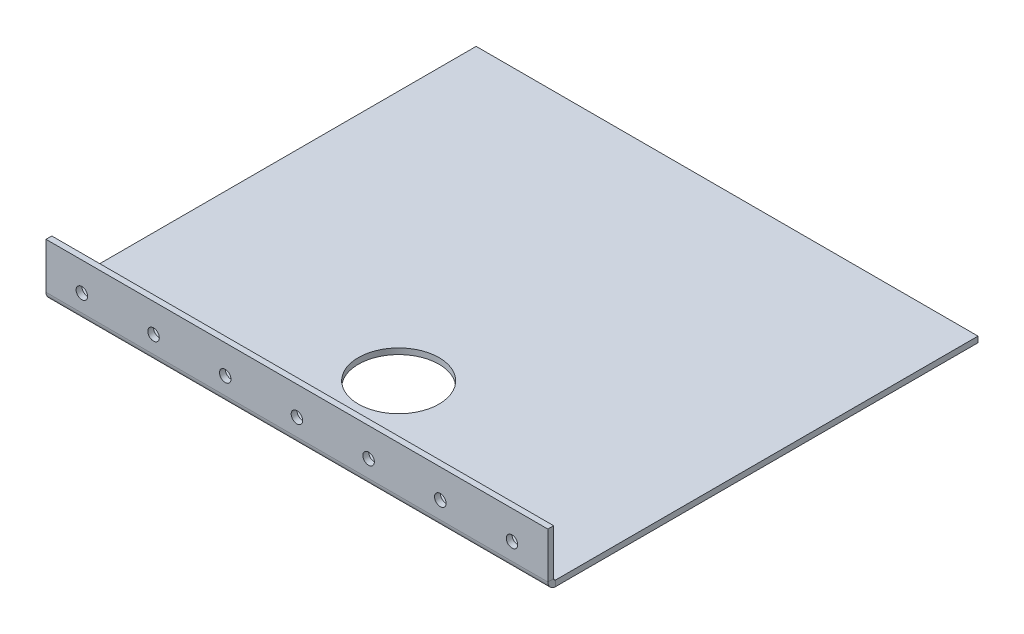
ISO-10303-21;
HEADER;
FILE_DESCRIPTION(('STEP AP214'),'2;1');
FILE_NAME('part.step','',(''),(''),'','','');
FILE_SCHEMA(('AUTOMOTIVE_DESIGN { 1 0 10303 214 1 1 1 1 }'));
ENDSEC;
DATA;
#1=APPLICATION_CONTEXT('core data for automotive mechanical design processes');
#2=APPLICATION_PROTOCOL_DEFINITION('international standard','automotive_design',2000,#1);
#3=PRODUCT_CONTEXT('',#1,'mechanical');
#4=PRODUCT('Part','Part','',(#3));
#5=PRODUCT_RELATED_PRODUCT_CATEGORY('part','',(#4));
#6=PRODUCT_DEFINITION_FORMATION('','',#4);
#7=PRODUCT_DEFINITION_CONTEXT('part definition',#1,'design');
#8=PRODUCT_DEFINITION('design','',#6,#7);
#9=PRODUCT_DEFINITION_SHAPE('','',#8);
#10=(LENGTH_UNIT() NAMED_UNIT(*) SI_UNIT(.MILLI.,.METRE.));
#11=(NAMED_UNIT(*) PLANE_ANGLE_UNIT() SI_UNIT($,.RADIAN.));
#12=(NAMED_UNIT(*) SI_UNIT($,.STERADIAN.) SOLID_ANGLE_UNIT());
#13=UNCERTAINTY_MEASURE_WITH_UNIT(LENGTH_MEASURE(1.E-05),#10,'distance_accuracy_value','');
#14=(GEOMETRIC_REPRESENTATION_CONTEXT(3) GLOBAL_UNCERTAINTY_ASSIGNED_CONTEXT((#13)) GLOBAL_UNIT_ASSIGNED_CONTEXT((#10,
#11,#12)) REPRESENTATION_CONTEXT('',''));
#15=CARTESIAN_POINT('',(0.,0.,0.));
#16=DIRECTION('',(0.,0.,1.));
#17=DIRECTION('',(1.,0.,0.));
#18=AXIS2_PLACEMENT_3D('',#15,#16,#17);
#19=CARTESIAN_POINT('',(-5461.00000000001,-2.05232,-2754.08571428572));
#20=DIRECTION('',(1.,0.,0.));
#21=DIRECTION('',(0.,0.,-1.));
#22=AXIS2_PLACEMENT_3D('',#19,#20,#21);
#23=PLANE('',#22);
#24=DIRECTION('',(0.,0.,-1.));
#25=VECTOR('',#24,1.);
#26=CARTESIAN_POINT('',(-5461.00000000001,0.,-2754.08571428572));
#27=LINE('',#26,#25);
#28=CARTESIAN_POINT('',(-5461.00000000001,0.,-2604.47463428571));
#29=VERTEX_POINT('',#28);
#30=CARTESIAN_POINT('',(-5461.00000000001,0.,-2754.08571428572));
#31=VERTEX_POINT('',#30);
#32=EDGE_CURVE('E102',#29,#31,#27,.T.);
#33=ORIENTED_EDGE('',*,*,#32,.F.);
#34=DIRECTION('',(0.,-1.,6.02890591705054E-13));
#35=VECTOR('',#34,1.);
#36=CARTESIAN_POINT('',(-5461.00000000001,0.,-2604.47463428571));
#37=LINE('',#36,#35);
#38=CARTESIAN_POINT('',(-5461.00000000001,-2.05232,-2604.47463428571));
#39=VERTEX_POINT('',#38);
#40=EDGE_CURVE('E115',#29,#39,#37,.T.);
#41=ORIENTED_EDGE('',*,*,#40,.T.);
#42=DIRECTION('',(0.,0.,-1.));
#43=VECTOR('',#42,1.);
#44=CARTESIAN_POINT('',(-5461.00000000001,-2.05232,-2754.08571428572));
#45=LINE('',#44,#43);
#46=CARTESIAN_POINT('',(-5461.00000000001,-2.05232,-2754.08571428572));
#47=VERTEX_POINT('',#46);
#48=EDGE_CURVE('E108',#39,#47,#45,.T.);
#49=ORIENTED_EDGE('',*,*,#48,.T.);
#50=DIRECTION('',(0.,1.,0.));
#51=VECTOR('',#50,1.);
#52=CARTESIAN_POINT('',(-5461.00000000001,-2.05232,-2754.08571428572));
#53=LINE('',#52,#51);
#54=EDGE_CURVE('E64',#47,#31,#53,.T.);
#55=ORIENTED_EDGE('',*,*,#54,.T.);
#56=EDGE_LOOP('',(#33,#41,#49,#55));
#57=FACE_BOUND('',#56,.T.);
#58=ADVANCED_FACE('F55',(#57),#23,.T.);
#59=CARTESIAN_POINT('',(0.,-2.05232,0.));
#60=DIRECTION('',(0.,1.,0.));
#61=DIRECTION('',(0.,0.,1.));
#62=AXIS2_PLACEMENT_3D('',#59,#60,#61);
#63=PLANE('',#62);
#64=CARTESIAN_POINT('',(-5549.90000000001,-2.05232,-2637.73339428571));
#65=DIRECTION('',(0.,-1.,0.));
#66=DIRECTION('',(0.,0.,-1.));
#67=AXIS2_PLACEMENT_3D('',#64,#65,#66);
#68=CIRCLE('',#67,14.2875);
#69=CARTESIAN_POINT('',(-5549.90000000001,-2.05232,-2652.02089428571));
#70=VERTEX_POINT('',#69);
#71=EDGE_CURVE('E213',#70,#70,#68,.T.);
#72=ORIENTED_EDGE('',*,*,#71,.F.);
#73=EDGE_LOOP('',(#72));
#74=FACE_BOUND('',#73,.T.);
#75=DIRECTION('',(1.,0.,0.));
#76=VECTOR('',#75,1.);
#77=CARTESIAN_POINT('',(-5461.00000000001,-2.05232,-2604.47463428571));
#78=LINE('',#77,#76);
#79=CARTESIAN_POINT('',(-5638.80000000001,-2.05232,-2604.47463428571));
#80=VERTEX_POINT('',#79);
#81=EDGE_CURVE('E131',#39,#80,#78,.F.);
#82=ORIENTED_EDGE('',*,*,#81,.T.);
#83=DIRECTION('',(0.,0.,1.));
#84=VECTOR('',#83,1.);
#85=CARTESIAN_POINT('',(-5638.80000000001,-2.05232,-2754.08571428572));
#86=LINE('',#85,#84);
#87=CARTESIAN_POINT('',(-5638.80000000001,-2.05232,-2754.08571428572));
#88=VERTEX_POINT('',#87);
#89=EDGE_CURVE('E106',#88,#80,#86,.T.);
#90=ORIENTED_EDGE('',*,*,#89,.F.);
#91=DIRECTION('',(-1.,0.,0.));
#92=VECTOR('',#91,1.);
#93=CARTESIAN_POINT('',(-5638.80000000001,-2.05232,-2754.08571428572));
#94=LINE('',#93,#92);
#95=EDGE_CURVE('E96',#47,#88,#94,.T.);
#96=ORIENTED_EDGE('',*,*,#95,.F.);
#97=ORIENTED_EDGE('',*,*,#48,.F.);
#98=EDGE_LOOP('',(#82,#90,#96,#97));
#99=FACE_BOUND('',#98,.T.);
#100=ADVANCED_FACE('F223',(#74,#99),#63,.F.);
#101=CARTESIAN_POINT('',(0.,0.,0.));
#102=DIRECTION('',(0.,1.,0.));
#103=DIRECTION('',(0.,0.,1.));
#104=AXIS2_PLACEMENT_3D('',#101,#102,#103);
#105=PLANE('',#104);
#106=CARTESIAN_POINT('',(-5549.90000000001,0.,-2637.73339428571));
#107=DIRECTION('',(0.,1.,0.));
#108=DIRECTION('',(0.,0.,1.));
#109=AXIS2_PLACEMENT_3D('',#106,#107,#108);
#110=CIRCLE('',#109,14.2875);
#111=CARTESIAN_POINT('',(-5549.90000000001,0.,-2623.44589428571));
#112=VERTEX_POINT('',#111);
#113=EDGE_CURVE('E59',#112,#112,#110,.T.);
#114=ORIENTED_EDGE('',*,*,#113,.F.);
#115=EDGE_LOOP('',(#114));
#116=FACE_BOUND('',#115,.T.);
#117=DIRECTION('',(0.,0.,1.));
#118=VECTOR('',#117,1.);
#119=CARTESIAN_POINT('',(-5638.80000000001,0.,-2754.08571428572));
#120=LINE('',#119,#118);
#121=CARTESIAN_POINT('',(-5638.80000000001,0.,-2754.08571428572));
#122=VERTEX_POINT('',#121);
#123=CARTESIAN_POINT('',(-5638.80000000001,0.,-2604.47463428571));
#124=VERTEX_POINT('',#123);
#125=EDGE_CURVE('E98',#122,#124,#120,.T.);
#126=ORIENTED_EDGE('',*,*,#125,.T.);
#127=DIRECTION('',(1.,0.,0.));
#128=VECTOR('',#127,1.);
#129=CARTESIAN_POINT('',(-5461.00000000001,0.,-2604.47463428571));
#130=LINE('',#129,#128);
#131=EDGE_CURVE('E72',#29,#124,#130,.F.);
#132=ORIENTED_EDGE('',*,*,#131,.F.);
#133=ORIENTED_EDGE('',*,*,#32,.T.);
#134=DIRECTION('',(-1.,0.,0.));
#135=VECTOR('',#134,1.);
#136=CARTESIAN_POINT('',(-5638.80000000001,0.,-2754.08571428572));
#137=LINE('',#136,#135);
#138=EDGE_CURVE('E94',#31,#122,#137,.T.);
#139=ORIENTED_EDGE('',*,*,#138,.T.);
#140=EDGE_LOOP('',(#126,#132,#133,#139));
#141=FACE_BOUND('',#140,.T.);
#142=ADVANCED_FACE('F104',(#116,#141),#105,.T.);
#143=CARTESIAN_POINT('',(-5638.80000000001,-2.05232,-2754.08571428572));
#144=DIRECTION('',(-1.,0.,0.));
#145=DIRECTION('',(0.,0.,1.));
#146=AXIS2_PLACEMENT_3D('',#143,#144,#145);
#147=PLANE('',#146);
#148=DIRECTION('',(0.,-1.,6.02890591705054E-13));
#149=VECTOR('',#148,1.);
#150=CARTESIAN_POINT('',(-5638.80000000001,0.,-2604.47463428571));
#151=LINE('',#150,#149);
#152=EDGE_CURVE('E101',#124,#80,#151,.T.);
#153=ORIENTED_EDGE('',*,*,#152,.F.);
#154=ORIENTED_EDGE('',*,*,#125,.F.);
#155=DIRECTION('',(0.,1.,0.));
#156=VECTOR('',#155,1.);
#157=CARTESIAN_POINT('',(-5638.80000000001,-2.05232,-2754.08571428572));
#158=LINE('',#157,#156);
#159=EDGE_CURVE('E13',#88,#122,#158,.T.);
#160=ORIENTED_EDGE('',*,*,#159,.F.);
#161=ORIENTED_EDGE('',*,*,#89,.T.);
#162=EDGE_LOOP('',(#153,#154,#160,#161));
#163=FACE_BOUND('',#162,.T.);
#164=ADVANCED_FACE('F57',(#163),#147,.T.);
#165=CARTESIAN_POINT('',(-5638.80000000001,-2.05232,-2754.08571428572));
#166=DIRECTION('',(0.,0.,-1.));
#167=DIRECTION('',(-1.,0.,0.));
#168=AXIS2_PLACEMENT_3D('',#165,#166,#167);
#169=PLANE('',#168);
#170=ORIENTED_EDGE('',*,*,#138,.F.);
#171=ORIENTED_EDGE('',*,*,#54,.F.);
#172=ORIENTED_EDGE('',*,*,#95,.T.);
#173=ORIENTED_EDGE('',*,*,#159,.T.);
#174=EDGE_LOOP('',(#170,#171,#172,#173));
#175=FACE_BOUND('',#174,.T.);
#176=ADVANCED_FACE('F91',(#175),#169,.T.);
#177=CARTESIAN_POINT('',(-5638.80000000001,0.736600000000198,-2604.47463428571));
#178=DIRECTION('',(-1.,0.,0.));
#179=DIRECTION('',(0.,0.,1.));
#180=AXIS2_PLACEMENT_3D('',#177,#178,#179);
#181=PLANE('',#180);
#182=DIRECTION('',(0.,0.,-1.));
#183=VECTOR('',#182,1.);
#184=CARTESIAN_POINT('',(-5638.80000000001,0.736600000000198,-2601.68571428571));
#185=LINE('',#184,#183);
#186=CARTESIAN_POINT('',(-5638.80000000001,0.736600000000198,-2603.73803428571));
#187=VERTEX_POINT('',#186);
#188=CARTESIAN_POINT('',(-5638.80000000001,0.736600000000198,-2601.68571428571));
#189=VERTEX_POINT('',#188);
#190=EDGE_CURVE('E136',#187,#189,#185,.F.);
#191=ORIENTED_EDGE('',*,*,#190,.F.);
#192=CARTESIAN_POINT('',(-5638.80000000001,0.736600000000198,-2604.47463428571));
#193=DIRECTION('',(1.,0.,0.));
#194=DIRECTION('',(0.,0.,-1.));
#195=AXIS2_PLACEMENT_3D('',#192,#193,#194);
#196=CIRCLE('',#195,0.736600000000198);
#197=EDGE_CURVE('E125',#124,#187,#196,.F.);
#198=ORIENTED_EDGE('',*,*,#197,.F.);
#199=ORIENTED_EDGE('',*,*,#152,.T.);
#200=CARTESIAN_POINT('',(-5638.80000000001,0.736600000000198,-2604.47463428571));
#201=DIRECTION('',(1.,0.,0.));
#202=DIRECTION('',(0.,0.,-1.));
#203=AXIS2_PLACEMENT_3D('',#200,#201,#202);
#204=CIRCLE('',#203,2.7889200000002);
#205=EDGE_CURVE('E118',#80,#189,#204,.F.);
#206=ORIENTED_EDGE('',*,*,#205,.T.);
#207=EDGE_LOOP('',(#191,#198,#199,#206));
#208=FACE_BOUND('',#207,.T.);
#209=ADVANCED_FACE('F238',(#208),#181,.T.);
#210=CARTESIAN_POINT('',(-5461.00000000001,0.736600000000198,-2604.47463428571));
#211=DIRECTION('',(-1.,0.,0.));
#212=DIRECTION('',(0.,0.,1.));
#213=AXIS2_PLACEMENT_3D('',#210,#211,#212);
#214=PLANE('',#213);
#215=CARTESIAN_POINT('',(-5461.00000000001,0.736600000000198,-2604.47463428571));
#216=DIRECTION('',(1.,0.,0.));
#217=DIRECTION('',(0.,0.,-1.));
#218=AXIS2_PLACEMENT_3D('',#215,#216,#217);
#219=CIRCLE('',#218,0.736600000000198);
#220=CARTESIAN_POINT('',(-5461.00000000001,0.736600000000198,-2603.73803428571));
#221=VERTEX_POINT('',#220);
#222=EDGE_CURVE('E120',#221,#29,#219,.T.);
#223=ORIENTED_EDGE('',*,*,#222,.F.);
#224=DIRECTION('',(0.,0.,-1.));
#225=VECTOR('',#224,1.);
#226=CARTESIAN_POINT('',(-5461.00000000001,0.736600000000198,-2603.73803428571));
#227=LINE('',#226,#225);
#228=CARTESIAN_POINT('',(-5461.00000000001,0.736600000000198,-2601.68571428571));
#229=VERTEX_POINT('',#228);
#230=EDGE_CURVE('E143',#221,#229,#227,.F.);
#231=ORIENTED_EDGE('',*,*,#230,.T.);
#232=CARTESIAN_POINT('',(-5461.00000000001,0.736600000000198,-2604.47463428571));
#233=DIRECTION('',(1.,0.,0.));
#234=DIRECTION('',(0.,0.,-1.));
#235=AXIS2_PLACEMENT_3D('',#232,#233,#234);
#236=CIRCLE('',#235,2.7889200000002);
#237=EDGE_CURVE('E128',#229,#39,#236,.T.);
#238=ORIENTED_EDGE('',*,*,#237,.T.);
#239=ORIENTED_EDGE('',*,*,#40,.F.);
#240=EDGE_LOOP('',(#223,#231,#238,#239));
#241=FACE_BOUND('',#240,.T.);
#242=ADVANCED_FACE('F242',(#241),#214,.F.);
#243=CARTESIAN_POINT('',(-5461.00000000001,0.736600000000198,-2604.47463428571));
#244=DIRECTION('',(1.,0.,0.));
#245=DIRECTION('',(0.,0.,1.));
#246=AXIS2_PLACEMENT_3D('',#243,#244,#245);
#247=CYLINDRICAL_SURFACE('',#246,2.7889200000002);
#248=ORIENTED_EDGE('',*,*,#81,.F.);
#249=ORIENTED_EDGE('',*,*,#237,.F.);
#250=DIRECTION('',(1.,0.,0.));
#251=VECTOR('',#250,1.);
#252=CARTESIAN_POINT('',(-5638.80000000001,0.736600000000198,-2601.68571428571));
#253=LINE('',#252,#251);
#254=EDGE_CURVE('E146',#229,#189,#253,.F.);
#255=ORIENTED_EDGE('',*,*,#254,.T.);
#256=ORIENTED_EDGE('',*,*,#205,.F.);
#257=EDGE_LOOP('',(#248,#249,#255,#256));
#258=FACE_BOUND('',#257,.T.);
#259=ADVANCED_FACE('F248',(#258),#247,.T.);
#260=CARTESIAN_POINT('',(-5461.00000000001,0.736600000000198,-2604.47463428571));
#261=DIRECTION('',(1.,0.,0.));
#262=DIRECTION('',(0.,0.,1.));
#263=AXIS2_PLACEMENT_3D('',#260,#261,#262);
#264=CYLINDRICAL_SURFACE('',#263,0.736600000000198);
#265=ORIENTED_EDGE('',*,*,#131,.T.);
#266=ORIENTED_EDGE('',*,*,#197,.T.);
#267=DIRECTION('',(1.,0.,0.));
#268=VECTOR('',#267,1.);
#269=CARTESIAN_POINT('',(-5638.80000000001,0.736600000000198,-2603.73803428571));
#270=LINE('',#269,#268);
#271=EDGE_CURVE('E139',#187,#221,#270,.T.);
#272=ORIENTED_EDGE('',*,*,#271,.T.);
#273=ORIENTED_EDGE('',*,*,#222,.T.);
#274=EDGE_LOOP('',(#265,#266,#272,#273));
#275=FACE_BOUND('',#274,.T.);
#276=ADVANCED_FACE('F253',(#275),#264,.F.);
#277=CARTESIAN_POINT('',(-5461.00000000001,16.99768,-2601.68571428571));
#278=DIRECTION('',(-1.,0.,0.));
#279=DIRECTION('',(0.,0.,1.));
#280=AXIS2_PLACEMENT_3D('',#277,#278,#279);
#281=PLANE('',#280);
#282=ORIENTED_EDGE('',*,*,#230,.F.);
#283=DIRECTION('',(0.,-1.,0.));
#284=VECTOR('',#283,1.);
#285=CARTESIAN_POINT('',(-5461.00000000001,16.99768,-2603.73803428571));
#286=LINE('',#285,#284);
#287=CARTESIAN_POINT('',(-5461.00000000001,16.99768,-2603.73803428571));
#288=VERTEX_POINT('',#287);
#289=EDGE_CURVE('E149',#221,#288,#286,.F.);
#290=ORIENTED_EDGE('',*,*,#289,.T.);
#291=DIRECTION('',(0.,0.,-1.));
#292=VECTOR('',#291,1.);
#293=CARTESIAN_POINT('',(-5461.00000000001,16.99768,-2601.68571428571));
#294=LINE('',#293,#292);
#295=CARTESIAN_POINT('',(-5461.00000000001,16.99768,-2601.68571428571));
#296=VERTEX_POINT('',#295);
#297=EDGE_CURVE('E123',#296,#288,#294,.T.);
#298=ORIENTED_EDGE('',*,*,#297,.F.);
#299=DIRECTION('',(0.,1.,0.));
#300=VECTOR('',#299,1.);
#301=CARTESIAN_POINT('',(-5461.00000000001,0.,-2601.68571428571));
#302=LINE('',#301,#300);
#303=EDGE_CURVE('E158',#229,#296,#302,.T.);
#304=ORIENTED_EDGE('',*,*,#303,.F.);
#305=EDGE_LOOP('',(#282,#290,#298,#304));
#306=FACE_BOUND('',#305,.T.);
#307=ADVANCED_FACE('F256',(#306),#281,.F.);
#308=CARTESIAN_POINT('',(-5638.80000000001,0.,-2601.68571428571));
#309=DIRECTION('',(1.,-1.56758761142719E-13,0.));
#310=DIRECTION('',(1.56758761142719E-13,1.,0.));
#311=AXIS2_PLACEMENT_3D('',#308,#309,#310);
#312=PLANE('',#311);
#313=ORIENTED_EDGE('',*,*,#190,.T.);
#314=DIRECTION('',(-1.56758761142719E-13,-1.,0.));
#315=VECTOR('',#314,1.);
#316=CARTESIAN_POINT('',(-5638.80000000001,8.83931302331567E-10,-2601.68571428571));
#317=LINE('',#316,#315);
#318=CARTESIAN_POINT('',(-5638.80000000001,16.99768,-2601.68571428571));
#319=VERTEX_POINT('',#318);
#320=EDGE_CURVE('E164',#319,#189,#317,.T.);
#321=ORIENTED_EDGE('',*,*,#320,.F.);
#322=DIRECTION('',(0.,0.,-1.));
#323=VECTOR('',#322,1.);
#324=CARTESIAN_POINT('',(-5638.80000000001,16.99768,-2601.68571428571));
#325=LINE('',#324,#323);
#326=CARTESIAN_POINT('',(-5638.80000000001,16.99768,-2603.73803428571));
#327=VERTEX_POINT('',#326);
#328=EDGE_CURVE('E167',#319,#327,#325,.T.);
#329=ORIENTED_EDGE('',*,*,#328,.T.);
#330=DIRECTION('',(1.56758761142719E-13,1.,0.));
#331=VECTOR('',#330,1.);
#332=CARTESIAN_POINT('',(-5638.80000000001,0.,-2603.73803428571));
#333=LINE('',#332,#331);
#334=EDGE_CURVE('E155',#327,#187,#333,.F.);
#335=ORIENTED_EDGE('',*,*,#334,.T.);
#336=EDGE_LOOP('',(#313,#321,#329,#335));
#337=FACE_BOUND('',#336,.T.);
#338=ADVANCED_FACE('F263',(#337),#312,.F.);
#339=CARTESIAN_POINT('',(0.,0.,-2601.68571428571));
#340=DIRECTION('',(0.,0.,-1.));
#341=DIRECTION('',(-1.,0.,0.));
#342=AXIS2_PLACEMENT_3D('',#339,#340,#341);
#343=PLANE('',#342);
#344=CARTESIAN_POINT('',(-5473.70000000001,6.83767999999894,-2601.68571428571));
#345=DIRECTION('',(0.,0.,-1.));
#346=DIRECTION('',(-1.,0.,0.));
#347=AXIS2_PLACEMENT_3D('',#344,#345,#346);
#348=CIRCLE('',#347,2.0320000000002);
#349=CARTESIAN_POINT('',(-5475.73200000001,6.83767999999894,-2601.68571428571));
#350=VERTEX_POINT('',#349);
#351=EDGE_CURVE('E207',#350,#350,#348,.T.);
#352=ORIENTED_EDGE('',*,*,#351,.T.);
#353=EDGE_LOOP('',(#352));
#354=FACE_BOUND('',#353,.T.);
#355=CARTESIAN_POINT('',(-5499.10000000001,6.83767999999912,-2601.68571428571));
#356=DIRECTION('',(0.,0.,-1.));
#357=DIRECTION('',(-1.,0.,0.));
#358=AXIS2_PLACEMENT_3D('',#355,#356,#357);
#359=CIRCLE('',#358,2.0320000000002);
#360=CARTESIAN_POINT('',(-5501.13200000001,6.83767999999912,-2601.68571428571));
#361=VERTEX_POINT('',#360);
#362=EDGE_CURVE('E201',#361,#361,#359,.T.);
#363=ORIENTED_EDGE('',*,*,#362,.T.);
#364=EDGE_LOOP('',(#363));
#365=FACE_BOUND('',#364,.T.);
#366=CARTESIAN_POINT('',(-5524.50000000001,6.8376799999993,-2601.68571428571));
#367=DIRECTION('',(0.,0.,-1.));
#368=DIRECTION('',(-1.,0.,0.));
#369=AXIS2_PLACEMENT_3D('',#366,#367,#368);
#370=CIRCLE('',#369,2.0320000000002);
#371=CARTESIAN_POINT('',(-5526.53200000001,6.8376799999993,-2601.68571428571));
#372=VERTEX_POINT('',#371);
#373=EDGE_CURVE('E195',#372,#372,#370,.T.);
#374=ORIENTED_EDGE('',*,*,#373,.T.);
#375=EDGE_LOOP('',(#374));
#376=FACE_BOUND('',#375,.T.);
#377=CARTESIAN_POINT('',(-5549.90000000001,6.83767999999948,-2601.68571428571));
#378=DIRECTION('',(0.,0.,-1.));
#379=DIRECTION('',(-1.,0.,0.));
#380=AXIS2_PLACEMENT_3D('',#377,#378,#379);
#381=CIRCLE('',#380,2.0320000000002);
#382=CARTESIAN_POINT('',(-5551.93200000001,6.83767999999948,-2601.68571428571));
#383=VERTEX_POINT('',#382);
#384=EDGE_CURVE('E189',#383,#383,#381,.T.);
#385=ORIENTED_EDGE('',*,*,#384,.T.);
#386=EDGE_LOOP('',(#385));
#387=FACE_BOUND('',#386,.T.);
#388=CARTESIAN_POINT('',(-5575.30000000001,6.83767999999965,-2601.68571428571));
#389=DIRECTION('',(0.,0.,-1.));
#390=DIRECTION('',(-1.,0.,0.));
#391=AXIS2_PLACEMENT_3D('',#388,#389,#390);
#392=CIRCLE('',#391,2.0320000000002);
#393=CARTESIAN_POINT('',(-5577.33200000001,6.83767999999965,-2601.68571428571));
#394=VERTEX_POINT('',#393);
#395=EDGE_CURVE('E183',#394,#394,#392,.T.);
#396=ORIENTED_EDGE('',*,*,#395,.T.);
#397=EDGE_LOOP('',(#396));
#398=FACE_BOUND('',#397,.T.);
#399=CARTESIAN_POINT('',(-5600.70000000001,6.83767999999983,-2601.68571428571));
#400=DIRECTION('',(0.,0.,-1.));
#401=DIRECTION('',(-1.,0.,0.));
#402=AXIS2_PLACEMENT_3D('',#399,#400,#401);
#403=CIRCLE('',#402,2.0320000000002);
#404=CARTESIAN_POINT('',(-5602.73200000001,6.83767999999983,-2601.68571428571));
#405=VERTEX_POINT('',#404);
#406=EDGE_CURVE('E177',#405,#405,#403,.T.);
#407=ORIENTED_EDGE('',*,*,#406,.T.);
#408=EDGE_LOOP('',(#407));
#409=FACE_BOUND('',#408,.T.);
#410=CARTESIAN_POINT('',(-5626.10000000001,6.83768000000001,-2601.68571428571));
#411=DIRECTION('',(0.,0.,-1.));
#412=DIRECTION('',(-1.,0.,0.));
#413=AXIS2_PLACEMENT_3D('',#410,#411,#412);
#414=CIRCLE('',#413,2.0320000000002);
#415=CARTESIAN_POINT('',(-5628.13200000001,6.83768000000001,-2601.68571428571));
#416=VERTEX_POINT('',#415);
#417=EDGE_CURVE('E140',#416,#416,#414,.T.);
#418=ORIENTED_EDGE('',*,*,#417,.T.);
#419=EDGE_LOOP('',(#418));
#420=FACE_BOUND('',#419,.T.);
#421=ORIENTED_EDGE('',*,*,#254,.F.);
#422=ORIENTED_EDGE('',*,*,#303,.T.);
#423=DIRECTION('',(-1.,0.,0.));
#424=VECTOR('',#423,1.);
#425=CARTESIAN_POINT('',(0.,16.99768,-2601.68571428571));
#426=LINE('',#425,#424);
#427=EDGE_CURVE('E161',#296,#319,#426,.T.);
#428=ORIENTED_EDGE('',*,*,#427,.T.);
#429=ORIENTED_EDGE('',*,*,#320,.T.);
#430=EDGE_LOOP('',(#421,#422,#428,#429));
#431=FACE_BOUND('',#430,.T.);
#432=ADVANCED_FACE('F273',(#354,#365,#376,#387,#398,#409,#420,#431),#343,.F.);
#433=CARTESIAN_POINT('',(0.,0.,-2603.73803428571));
#434=DIRECTION('',(0.,0.,-1.));
#435=DIRECTION('',(-1.,0.,0.));
#436=AXIS2_PLACEMENT_3D('',#433,#434,#435);
#437=PLANE('',#436);
#438=CARTESIAN_POINT('',(-5473.70000000001,6.83767999999894,-2603.73803428571));
#439=DIRECTION('',(0.,0.,-1.));
#440=DIRECTION('',(-1.,0.,0.));
#441=AXIS2_PLACEMENT_3D('',#438,#439,#440);
#442=CIRCLE('',#441,2.0320000000002);
#443=CARTESIAN_POINT('',(-5475.73200000001,6.83767999999894,-2603.73803428571));
#444=VERTEX_POINT('',#443);
#445=EDGE_CURVE('E210',#444,#444,#442,.T.);
#446=ORIENTED_EDGE('',*,*,#445,.F.);
#447=EDGE_LOOP('',(#446));
#448=FACE_BOUND('',#447,.T.);
#449=CARTESIAN_POINT('',(-5499.10000000001,6.83767999999912,-2603.73803428571));
#450=DIRECTION('',(0.,0.,-1.));
#451=DIRECTION('',(-1.,0.,0.));
#452=AXIS2_PLACEMENT_3D('',#449,#450,#451);
#453=CIRCLE('',#452,2.0320000000002);
#454=CARTESIAN_POINT('',(-5501.13200000001,6.83767999999912,-2603.73803428571));
#455=VERTEX_POINT('',#454);
#456=EDGE_CURVE('E204',#455,#455,#453,.T.);
#457=ORIENTED_EDGE('',*,*,#456,.F.);
#458=EDGE_LOOP('',(#457));
#459=FACE_BOUND('',#458,.T.);
#460=CARTESIAN_POINT('',(-5524.50000000001,6.8376799999993,-2603.73803428571));
#461=DIRECTION('',(0.,0.,-1.));
#462=DIRECTION('',(-1.,0.,0.));
#463=AXIS2_PLACEMENT_3D('',#460,#461,#462);
#464=CIRCLE('',#463,2.0320000000002);
#465=CARTESIAN_POINT('',(-5526.53200000001,6.8376799999993,-2603.73803428571));
#466=VERTEX_POINT('',#465);
#467=EDGE_CURVE('E198',#466,#466,#464,.T.);
#468=ORIENTED_EDGE('',*,*,#467,.F.);
#469=EDGE_LOOP('',(#468));
#470=FACE_BOUND('',#469,.T.);
#471=CARTESIAN_POINT('',(-5549.90000000001,6.83767999999948,-2603.73803428571));
#472=DIRECTION('',(0.,0.,-1.));
#473=DIRECTION('',(-1.,0.,0.));
#474=AXIS2_PLACEMENT_3D('',#471,#472,#473);
#475=CIRCLE('',#474,2.0320000000002);
#476=CARTESIAN_POINT('',(-5551.93200000001,6.83767999999948,-2603.73803428571));
#477=VERTEX_POINT('',#476);
#478=EDGE_CURVE('E192',#477,#477,#475,.T.);
#479=ORIENTED_EDGE('',*,*,#478,.F.);
#480=EDGE_LOOP('',(#479));
#481=FACE_BOUND('',#480,.T.);
#482=CARTESIAN_POINT('',(-5575.30000000001,6.83767999999965,-2603.73803428571));
#483=DIRECTION('',(0.,0.,-1.));
#484=DIRECTION('',(-1.,0.,0.));
#485=AXIS2_PLACEMENT_3D('',#482,#483,#484);
#486=CIRCLE('',#485,2.0320000000002);
#487=CARTESIAN_POINT('',(-5577.33200000001,6.83767999999965,-2603.73803428571));
#488=VERTEX_POINT('',#487);
#489=EDGE_CURVE('E186',#488,#488,#486,.T.);
#490=ORIENTED_EDGE('',*,*,#489,.F.);
#491=EDGE_LOOP('',(#490));
#492=FACE_BOUND('',#491,.T.);
#493=CARTESIAN_POINT('',(-5600.70000000001,6.83767999999983,-2603.73803428571));
#494=DIRECTION('',(0.,0.,-1.));
#495=DIRECTION('',(-1.,0.,0.));
#496=AXIS2_PLACEMENT_3D('',#493,#494,#495);
#497=CIRCLE('',#496,2.0320000000002);
#498=CARTESIAN_POINT('',(-5602.73200000001,6.83767999999983,-2603.73803428571));
#499=VERTEX_POINT('',#498);
#500=EDGE_CURVE('E180',#499,#499,#497,.T.);
#501=ORIENTED_EDGE('',*,*,#500,.F.);
#502=EDGE_LOOP('',(#501));
#503=FACE_BOUND('',#502,.T.);
#504=CARTESIAN_POINT('',(-5626.10000000001,6.83768000000001,-2603.73803428571));
#505=DIRECTION('',(0.,0.,-1.));
#506=DIRECTION('',(-1.,0.,0.));
#507=AXIS2_PLACEMENT_3D('',#504,#505,#506);
#508=CIRCLE('',#507,2.0320000000002);
#509=CARTESIAN_POINT('',(-5628.13200000001,6.83768000000001,-2603.73803428571));
#510=VERTEX_POINT('',#509);
#511=EDGE_CURVE('E174',#510,#510,#508,.T.);
#512=ORIENTED_EDGE('',*,*,#511,.F.);
#513=EDGE_LOOP('',(#512));
#514=FACE_BOUND('',#513,.T.);
#515=ORIENTED_EDGE('',*,*,#289,.F.);
#516=ORIENTED_EDGE('',*,*,#271,.F.);
#517=ORIENTED_EDGE('',*,*,#334,.F.);
#518=DIRECTION('',(1.,0.,0.));
#519=VECTOR('',#518,1.);
#520=CARTESIAN_POINT('',(-5638.80000000001,16.99768,-2603.73803428571));
#521=LINE('',#520,#519);
#522=EDGE_CURVE('E152',#288,#327,#521,.F.);
#523=ORIENTED_EDGE('',*,*,#522,.F.);
#524=EDGE_LOOP('',(#515,#516,#517,#523));
#525=FACE_BOUND('',#524,.T.);
#526=ADVANCED_FACE('F269',(#448,#459,#470,#481,#492,#503,#514,#525),#437,.T.);
#527=CARTESIAN_POINT('',(-5638.80000000001,16.99768,-2601.68571428571));
#528=DIRECTION('',(0.,-1.,0.));
#529=DIRECTION('',(0.,0.,-1.));
#530=AXIS2_PLACEMENT_3D('',#527,#528,#529);
#531=PLANE('',#530);
#532=ORIENTED_EDGE('',*,*,#522,.T.);
#533=ORIENTED_EDGE('',*,*,#328,.F.);
#534=ORIENTED_EDGE('',*,*,#427,.F.);
#535=ORIENTED_EDGE('',*,*,#297,.T.);
#536=EDGE_LOOP('',(#532,#533,#534,#535));
#537=FACE_BOUND('',#536,.T.);
#538=ADVANCED_FACE('F265',(#537),#531,.F.);
#539=CARTESIAN_POINT('',(-5626.10000000001,6.83768000000001,-2601.19803428571));
#540=DIRECTION('',(0.,0.,-1.));
#541=DIRECTION('',(-1.,0.,0.));
#542=AXIS2_PLACEMENT_3D('',#539,#540,#541);
#543=CYLINDRICAL_SURFACE('',#542,2.0320000000002);
#544=ORIENTED_EDGE('',*,*,#511,.T.);
#545=EDGE_LOOP('',(#544));
#546=FACE_BOUND('',#545,.T.);
#547=ORIENTED_EDGE('',*,*,#417,.F.);
#548=EDGE_LOOP('',(#547));
#549=FACE_BOUND('',#548,.T.);
#550=ADVANCED_FACE('F268',(#546,#549),#543,.F.);
#551=CARTESIAN_POINT('',(-5600.70000000001,6.83767999999983,-2601.19803428571));
#552=DIRECTION('',(0.,0.,-1.));
#553=DIRECTION('',(-1.,0.,0.));
#554=AXIS2_PLACEMENT_3D('',#551,#552,#553);
#555=CYLINDRICAL_SURFACE('',#554,2.0320000000002);
#556=ORIENTED_EDGE('',*,*,#500,.T.);
#557=EDGE_LOOP('',(#556));
#558=FACE_BOUND('',#557,.T.);
#559=ORIENTED_EDGE('',*,*,#406,.F.);
#560=EDGE_LOOP('',(#559));
#561=FACE_BOUND('',#560,.T.);
#562=ADVANCED_FACE('F283',(#558,#561),#555,.F.);
#563=CARTESIAN_POINT('',(-5575.30000000001,6.83767999999965,-2601.19803428571));
#564=DIRECTION('',(0.,0.,-1.));
#565=DIRECTION('',(-1.,0.,0.));
#566=AXIS2_PLACEMENT_3D('',#563,#564,#565);
#567=CYLINDRICAL_SURFACE('',#566,2.0320000000002);
#568=ORIENTED_EDGE('',*,*,#489,.T.);
#569=EDGE_LOOP('',(#568));
#570=FACE_BOUND('',#569,.T.);
#571=ORIENTED_EDGE('',*,*,#395,.F.);
#572=EDGE_LOOP('',(#571));
#573=FACE_BOUND('',#572,.T.);
#574=ADVANCED_FACE('F287',(#570,#573),#567,.F.);
#575=CARTESIAN_POINT('',(-5549.90000000001,6.83767999999948,-2601.19803428571));
#576=DIRECTION('',(0.,0.,-1.));
#577=DIRECTION('',(-1.,0.,0.));
#578=AXIS2_PLACEMENT_3D('',#575,#576,#577);
#579=CYLINDRICAL_SURFACE('',#578,2.0320000000002);
#580=ORIENTED_EDGE('',*,*,#478,.T.);
#581=EDGE_LOOP('',(#580));
#582=FACE_BOUND('',#581,.T.);
#583=ORIENTED_EDGE('',*,*,#384,.F.);
#584=EDGE_LOOP('',(#583));
#585=FACE_BOUND('',#584,.T.);
#586=ADVANCED_FACE('F291',(#582,#585),#579,.F.);
#587=CARTESIAN_POINT('',(-5524.50000000001,6.8376799999993,-2601.19803428571));
#588=DIRECTION('',(0.,0.,-1.));
#589=DIRECTION('',(-1.,0.,0.));
#590=AXIS2_PLACEMENT_3D('',#587,#588,#589);
#591=CYLINDRICAL_SURFACE('',#590,2.0320000000002);
#592=ORIENTED_EDGE('',*,*,#467,.T.);
#593=EDGE_LOOP('',(#592));
#594=FACE_BOUND('',#593,.T.);
#595=ORIENTED_EDGE('',*,*,#373,.F.);
#596=EDGE_LOOP('',(#595));
#597=FACE_BOUND('',#596,.T.);
#598=ADVANCED_FACE('F295',(#594,#597),#591,.F.);
#599=CARTESIAN_POINT('',(-5499.10000000001,6.83767999999912,-2601.19803428571));
#600=DIRECTION('',(0.,0.,-1.));
#601=DIRECTION('',(-1.,0.,0.));
#602=AXIS2_PLACEMENT_3D('',#599,#600,#601);
#603=CYLINDRICAL_SURFACE('',#602,2.0320000000002);
#604=ORIENTED_EDGE('',*,*,#456,.T.);
#605=EDGE_LOOP('',(#604));
#606=FACE_BOUND('',#605,.T.);
#607=ORIENTED_EDGE('',*,*,#362,.F.);
#608=EDGE_LOOP('',(#607));
#609=FACE_BOUND('',#608,.T.);
#610=ADVANCED_FACE('F299',(#606,#609),#603,.F.);
#611=CARTESIAN_POINT('',(-5473.70000000001,6.83767999999894,-2601.19803428571));
#612=DIRECTION('',(0.,0.,-1.));
#613=DIRECTION('',(-1.,0.,0.));
#614=AXIS2_PLACEMENT_3D('',#611,#612,#613);
#615=CYLINDRICAL_SURFACE('',#614,2.0320000000002);
#616=ORIENTED_EDGE('',*,*,#445,.T.);
#617=EDGE_LOOP('',(#616));
#618=FACE_BOUND('',#617,.T.);
#619=ORIENTED_EDGE('',*,*,#351,.F.);
#620=EDGE_LOOP('',(#619));
#621=FACE_BOUND('',#620,.T.);
#622=ADVANCED_FACE('F303',(#618,#621),#615,.F.);
#623=CARTESIAN_POINT('',(-5549.90000000001,0.48768,-2637.73339428571));
#624=DIRECTION('',(0.,-1.,0.));
#625=DIRECTION('',(0.,0.,-1.));
#626=AXIS2_PLACEMENT_3D('',#623,#624,#625);
#627=CYLINDRICAL_SURFACE('',#626,14.2875);
#628=ORIENTED_EDGE('',*,*,#113,.T.);
#629=EDGE_LOOP('',(#628));
#630=FACE_BOUND('',#629,.T.);
#631=ORIENTED_EDGE('',*,*,#71,.T.);
#632=EDGE_LOOP('',(#631));
#633=FACE_BOUND('',#632,.T.);
#634=ADVANCED_FACE('F220',(#630,#633),#627,.F.);
#635=CLOSED_SHELL('',(#58,#100,#142,#164,#176,#209,#242,#259,#276,#307,#338,#432,#526,#538,#550,
#562,#574,#586,#598,#610,#622,#634));
#636=MANIFOLD_SOLID_BREP('B2',#635);
#637=ADVANCED_BREP_SHAPE_REPRESENTATION('',(#18,#636),#14);
#638=SHAPE_DEFINITION_REPRESENTATION(#9,#637);
ENDSEC;
END-ISO-10303-21;
